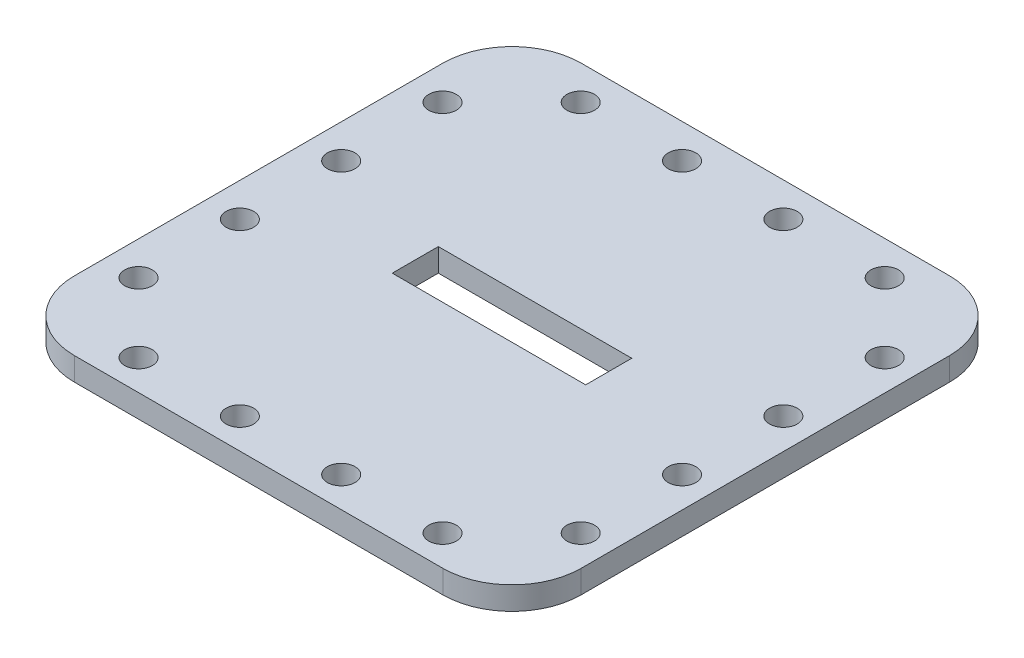
ISO-10303-21;
HEADER;
FILE_DESCRIPTION(('STEP AP214'),'2;1');
FILE_NAME('part.step','',(''),(''),'','','');
FILE_SCHEMA(('AUTOMOTIVE_DESIGN { 1 0 10303 214 1 1 1 1 }'));
ENDSEC;
DATA;
#1=APPLICATION_CONTEXT('core data for automotive mechanical design processes');
#2=APPLICATION_PROTOCOL_DEFINITION('international standard','automotive_design',2000,#1);
#3=PRODUCT_CONTEXT('',#1,'mechanical');
#4=PRODUCT('Part','Part','',(#3));
#5=PRODUCT_RELATED_PRODUCT_CATEGORY('part','',(#4));
#6=PRODUCT_DEFINITION_FORMATION('','',#4);
#7=PRODUCT_DEFINITION_CONTEXT('part definition',#1,'design');
#8=PRODUCT_DEFINITION('design','',#6,#7);
#9=PRODUCT_DEFINITION_SHAPE('','',#8);
#10=(LENGTH_UNIT() NAMED_UNIT(*) SI_UNIT(.MILLI.,.METRE.));
#11=(NAMED_UNIT(*) PLANE_ANGLE_UNIT() SI_UNIT($,.RADIAN.));
#12=(NAMED_UNIT(*) SI_UNIT($,.STERADIAN.) SOLID_ANGLE_UNIT());
#13=UNCERTAINTY_MEASURE_WITH_UNIT(LENGTH_MEASURE(1.E-05),#10,'distance_accuracy_value','');
#14=(GEOMETRIC_REPRESENTATION_CONTEXT(3) GLOBAL_UNCERTAINTY_ASSIGNED_CONTEXT((#13)) GLOBAL_UNIT_ASSIGNED_CONTEXT((#10,
#11,#12)) REPRESENTATION_CONTEXT('',''));
#15=CARTESIAN_POINT('',(0.,0.,0.));
#16=DIRECTION('',(0.,0.,1.));
#17=DIRECTION('',(1.,0.,0.));
#18=AXIS2_PLACEMENT_3D('',#15,#16,#17);
#19=CARTESIAN_POINT('',(40.,5.,55.));
#20=DIRECTION('',(0.,1.,0.));
#21=DIRECTION('',(0.,0.,1.));
#22=AXIS2_PLACEMENT_3D('',#19,#20,#21);
#23=PLANE('',#22);
#24=DIRECTION('',(0.,0.,-1.));
#25=VECTOR('',#24,1.);
#26=CARTESIAN_POINT('',(21.,5.,5.));
#27=LINE('',#26,#25);
#28=CARTESIAN_POINT('',(21.,5.,5.));
#29=VERTEX_POINT('',#28);
#30=CARTESIAN_POINT('',(21.,5.,-5.));
#31=VERTEX_POINT('',#30);
#32=EDGE_CURVE('E54',#29,#31,#27,.T.);
#33=ORIENTED_EDGE('',*,*,#32,.F.);
#34=DIRECTION('',(1.,0.,0.));
#35=VECTOR('',#34,1.);
#36=CARTESIAN_POINT('',(-21.,5.,5.));
#37=LINE('',#36,#35);
#38=CARTESIAN_POINT('',(-21.,5.,5.));
#39=VERTEX_POINT('',#38);
#40=EDGE_CURVE('E145',#39,#29,#37,.T.);
#41=ORIENTED_EDGE('',*,*,#40,.F.);
#42=DIRECTION('',(0.,0.,1.));
#43=VECTOR('',#42,1.);
#44=CARTESIAN_POINT('',(-21.,5.,5.));
#45=LINE('',#44,#43);
#46=CARTESIAN_POINT('',(-21.,5.,-5.));
#47=VERTEX_POINT('',#46);
#48=EDGE_CURVE('E130',#47,#39,#45,.T.);
#49=ORIENTED_EDGE('',*,*,#48,.F.);
#50=DIRECTION('',(-1.,0.,0.));
#51=VECTOR('',#50,1.);
#52=CARTESIAN_POINT('',(-21.,5.,-5.));
#53=LINE('',#52,#51);
#54=EDGE_CURVE('E139',#31,#47,#53,.T.);
#55=ORIENTED_EDGE('',*,*,#54,.F.);
#56=EDGE_LOOP('',(#33,#41,#49,#55));
#57=FACE_BOUND('',#56,.T.);
#58=CARTESIAN_POINT('',(48.3346963055934,5.,-10.5816296180082));
#59=DIRECTION('',(0.,-1.,0.));
#60=DIRECTION('',(0.,0.,-1.));
#61=AXIS2_PLACEMENT_3D('',#58,#59,#60);
#62=CIRCLE('',#61,3.00000000000002);
#63=CARTESIAN_POINT('',(48.3346963055934,5.,-13.5816296180082));
#64=VERTEX_POINT('',#63);
#65=EDGE_CURVE('E208',#64,#64,#62,.T.);
#66=ORIENTED_EDGE('',*,*,#65,.T.);
#67=EDGE_LOOP('',(#66));
#68=FACE_BOUND('',#67,.T.);
#69=CARTESIAN_POINT('',(-32.6653036944065,5.,-47.5816296180083));
#70=DIRECTION('',(0.,-1.,0.));
#71=DIRECTION('',(0.,0.,-1.));
#72=AXIS2_PLACEMENT_3D('',#69,#70,#71);
#73=CIRCLE('',#72,3.00000000000001);
#74=CARTESIAN_POINT('',(-32.6653036944065,5.,-50.5816296180083));
#75=VERTEX_POINT('',#74);
#76=EDGE_CURVE('E220',#75,#75,#73,.T.);
#77=ORIENTED_EDGE('',*,*,#76,.T.);
#78=EDGE_LOOP('',(#77));
#79=FACE_BOUND('',#78,.T.);
#80=CARTESIAN_POINT('',(-47.6653036944066,5.,-32.5816296180082));
#81=DIRECTION('',(0.,-1.,0.));
#82=DIRECTION('',(0.,0.,-1.));
#83=AXIS2_PLACEMENT_3D('',#80,#81,#82);
#84=CIRCLE('',#83,3.);
#85=CARTESIAN_POINT('',(-47.6653036944066,5.,-35.5816296180082));
#86=VERTEX_POINT('',#85);
#87=EDGE_CURVE('E223',#86,#86,#84,.T.);
#88=ORIENTED_EDGE('',*,*,#87,.T.);
#89=EDGE_LOOP('',(#88));
#90=FACE_BOUND('',#89,.T.);
#91=CARTESIAN_POINT('',(-47.6653036944066,5.,-10.5816296180082));
#92=DIRECTION('',(0.,-1.,0.));
#93=DIRECTION('',(0.,0.,-1.));
#94=AXIS2_PLACEMENT_3D('',#91,#92,#93);
#95=CIRCLE('',#94,3.00000000000003);
#96=CARTESIAN_POINT('',(-47.6653036944066,5.,-13.5816296180083));
#97=VERTEX_POINT('',#96);
#98=EDGE_CURVE('E226',#97,#97,#95,.T.);
#99=ORIENTED_EDGE('',*,*,#98,.T.);
#100=EDGE_LOOP('',(#99));
#101=FACE_BOUND('',#100,.T.);
#102=CARTESIAN_POINT('',(-47.6653036944066,5.,11.4183703819918));
#103=DIRECTION('',(0.,-1.,0.));
#104=DIRECTION('',(0.,0.,-1.));
#105=AXIS2_PLACEMENT_3D('',#102,#103,#104);
#106=CIRCLE('',#105,2.99999999999997);
#107=CARTESIAN_POINT('',(-47.6653036944066,5.,8.4183703819918));
#108=VERTEX_POINT('',#107);
#109=EDGE_CURVE('E229',#108,#108,#106,.T.);
#110=ORIENTED_EDGE('',*,*,#109,.T.);
#111=EDGE_LOOP('',(#110));
#112=FACE_BOUND('',#111,.T.);
#113=CARTESIAN_POINT('',(-10.6653036944066,5.,48.4183703819918));
#114=DIRECTION('',(0.,-1.,0.));
#115=DIRECTION('',(0.,0.,-1.));
#116=AXIS2_PLACEMENT_3D('',#113,#114,#115);
#117=CIRCLE('',#116,3.00000000000002);
#118=CARTESIAN_POINT('',(-10.6653036944066,5.,45.4183703819917));
#119=VERTEX_POINT('',#118);
#120=EDGE_CURVE('E232',#119,#119,#117,.T.);
#121=ORIENTED_EDGE('',*,*,#120,.T.);
#122=EDGE_LOOP('',(#121));
#123=FACE_BOUND('',#122,.T.);
#124=CARTESIAN_POINT('',(11.3346963055934,5.,48.4183703819918));
#125=DIRECTION('',(0.,-1.,0.));
#126=DIRECTION('',(0.,0.,-1.));
#127=AXIS2_PLACEMENT_3D('',#124,#125,#126);
#128=CIRCLE('',#127,2.99999999999997);
#129=CARTESIAN_POINT('',(11.3346963055934,5.,45.4183703819918));
#130=VERTEX_POINT('',#129);
#131=EDGE_CURVE('E235',#130,#130,#128,.T.);
#132=ORIENTED_EDGE('',*,*,#131,.T.);
#133=EDGE_LOOP('',(#132));
#134=FACE_BOUND('',#133,.T.);
#135=CARTESIAN_POINT('',(33.3346963055934,5.,48.4183703819918));
#136=DIRECTION('',(0.,-1.,0.));
#137=DIRECTION('',(0.,0.,-1.));
#138=AXIS2_PLACEMENT_3D('',#135,#136,#137);
#139=CIRCLE('',#138,3.00000000000001);
#140=CARTESIAN_POINT('',(33.3346963055934,5.,45.4183703819917));
#141=VERTEX_POINT('',#140);
#142=EDGE_CURVE('E238',#141,#141,#139,.T.);
#143=ORIENTED_EDGE('',*,*,#142,.T.);
#144=EDGE_LOOP('',(#143));
#145=FACE_BOUND('',#144,.T.);
#146=CARTESIAN_POINT('',(48.3346963055934,5.,11.4183703819918));
#147=DIRECTION('',(0.,-1.,0.));
#148=DIRECTION('',(0.,0.,-1.));
#149=AXIS2_PLACEMENT_3D('',#146,#147,#148);
#150=CIRCLE('',#149,2.99999999999997);
#151=CARTESIAN_POINT('',(48.3346963055934,5.,8.4183703819918));
#152=VERTEX_POINT('',#151);
#153=EDGE_CURVE('E241',#152,#152,#150,.T.);
#154=ORIENTED_EDGE('',*,*,#153,.T.);
#155=EDGE_LOOP('',(#154));
#156=FACE_BOUND('',#155,.T.);
#157=CARTESIAN_POINT('',(48.3346963055935,5.,-32.5816296180082));
#158=DIRECTION('',(0.,-1.,0.));
#159=DIRECTION('',(0.,0.,-1.));
#160=AXIS2_PLACEMENT_3D('',#157,#158,#159);
#161=CIRCLE('',#160,3.00000000000001);
#162=CARTESIAN_POINT('',(48.3346963055935,5.,-35.5816296180082));
#163=VERTEX_POINT('',#162);
#164=EDGE_CURVE('E244',#163,#163,#161,.T.);
#165=ORIENTED_EDGE('',*,*,#164,.T.);
#166=EDGE_LOOP('',(#165));
#167=FACE_BOUND('',#166,.T.);
#168=CARTESIAN_POINT('',(33.3346963055935,5.,-47.5816296180082));
#169=DIRECTION('',(0.,-1.,0.));
#170=DIRECTION('',(0.,0.,-1.));
#171=AXIS2_PLACEMENT_3D('',#168,#169,#170);
#172=CIRCLE('',#171,2.99999999999997);
#173=CARTESIAN_POINT('',(33.3346963055935,5.,-50.5816296180082));
#174=VERTEX_POINT('',#173);
#175=EDGE_CURVE('E247',#174,#174,#172,.T.);
#176=ORIENTED_EDGE('',*,*,#175,.T.);
#177=EDGE_LOOP('',(#176));
#178=FACE_BOUND('',#177,.T.);
#179=CARTESIAN_POINT('',(11.3346963055935,5.,-47.5816296180082));
#180=DIRECTION('',(0.,-1.,0.));
#181=DIRECTION('',(0.,0.,-1.));
#182=AXIS2_PLACEMENT_3D('',#179,#180,#181);
#183=CIRCLE('',#182,2.99999999999997);
#184=CARTESIAN_POINT('',(11.3346963055935,5.,-50.5816296180082));
#185=VERTEX_POINT('',#184);
#186=EDGE_CURVE('E250',#185,#185,#183,.T.);
#187=ORIENTED_EDGE('',*,*,#186,.T.);
#188=EDGE_LOOP('',(#187));
#189=FACE_BOUND('',#188,.T.);
#190=CARTESIAN_POINT('',(-10.6653036944065,5.,-47.5816296180082));
#191=DIRECTION('',(0.,-1.,0.));
#192=DIRECTION('',(0.,0.,-1.));
#193=AXIS2_PLACEMENT_3D('',#190,#191,#192);
#194=CIRCLE('',#193,3.00000000000002);
#195=CARTESIAN_POINT('',(-10.6653036944065,5.,-50.5816296180083));
#196=VERTEX_POINT('',#195);
#197=EDGE_CURVE('E253',#196,#196,#194,.T.);
#198=ORIENTED_EDGE('',*,*,#197,.T.);
#199=EDGE_LOOP('',(#198));
#200=FACE_BOUND('',#199,.T.);
#201=CARTESIAN_POINT('',(-47.6653036944065,5.,33.4183703819918));
#202=DIRECTION('',(0.,-1.,0.));
#203=DIRECTION('',(0.,0.,-1.));
#204=AXIS2_PLACEMENT_3D('',#201,#202,#203);
#205=CIRCLE('',#204,3.);
#206=CARTESIAN_POINT('',(-47.6653036944065,5.,30.4183703819918));
#207=VERTEX_POINT('',#206);
#208=EDGE_CURVE('E256',#207,#207,#205,.T.);
#209=ORIENTED_EDGE('',*,*,#208,.T.);
#210=EDGE_LOOP('',(#209));
#211=FACE_BOUND('',#210,.T.);
#212=CARTESIAN_POINT('',(-32.6653036944065,5.,48.4183703819918));
#213=DIRECTION('',(0.,-1.,0.));
#214=DIRECTION('',(0.,0.,-1.));
#215=AXIS2_PLACEMENT_3D('',#212,#213,#214);
#216=CIRCLE('',#215,3.00000000000001);
#217=CARTESIAN_POINT('',(-32.6653036944065,5.,45.4183703819918));
#218=VERTEX_POINT('',#217);
#219=EDGE_CURVE('E259',#218,#218,#216,.T.);
#220=ORIENTED_EDGE('',*,*,#219,.T.);
#221=EDGE_LOOP('',(#220));
#222=FACE_BOUND('',#221,.T.);
#223=CARTESIAN_POINT('',(48.3346963055934,5.,33.4183703819918));
#224=DIRECTION('',(0.,-1.,0.));
#225=DIRECTION('',(0.,0.,-1.));
#226=AXIS2_PLACEMENT_3D('',#223,#224,#225);
#227=CIRCLE('',#226,3.00000000000001);
#228=CARTESIAN_POINT('',(48.3346963055934,5.,30.4183703819918));
#229=VERTEX_POINT('',#228);
#230=EDGE_CURVE('E262',#229,#229,#227,.T.);
#231=ORIENTED_EDGE('',*,*,#230,.T.);
#232=EDGE_LOOP('',(#231));
#233=FACE_BOUND('',#232,.T.);
#234=DIRECTION('',(1.,0.,0.));
#235=VECTOR('',#234,1.);
#236=CARTESIAN_POINT('',(-55.,5.,55.));
#237=LINE('',#236,#235);
#238=CARTESIAN_POINT('',(-40.,5.,55.));
#239=VERTEX_POINT('',#238);
#240=CARTESIAN_POINT('',(40.,5.,55.));
#241=VERTEX_POINT('',#240);
#242=EDGE_CURVE('E195',#239,#241,#237,.T.);
#243=ORIENTED_EDGE('',*,*,#242,.T.);
#244=CARTESIAN_POINT('',(40.,5.,40.));
#245=DIRECTION('',(0.,-1.,0.));
#246=DIRECTION('',(0.,0.,-1.));
#247=AXIS2_PLACEMENT_3D('',#244,#245,#246);
#248=CIRCLE('',#247,15.);
#249=CARTESIAN_POINT('',(55.,5.,40.));
#250=VERTEX_POINT('',#249);
#251=EDGE_CURVE('E152',#241,#250,#248,.F.);
#252=ORIENTED_EDGE('',*,*,#251,.T.);
#253=DIRECTION('',(0.,0.,-1.));
#254=VECTOR('',#253,1.);
#255=CARTESIAN_POINT('',(55.,5.,55.));
#256=LINE('',#255,#254);
#257=CARTESIAN_POINT('',(55.,5.,-40.));
#258=VERTEX_POINT('',#257);
#259=EDGE_CURVE('E200',#250,#258,#256,.T.);
#260=ORIENTED_EDGE('',*,*,#259,.T.);
#261=CARTESIAN_POINT('',(40.,5.,-40.));
#262=DIRECTION('',(0.,-1.,0.));
#263=DIRECTION('',(0.,0.,-1.));
#264=AXIS2_PLACEMENT_3D('',#261,#262,#263);
#265=CIRCLE('',#264,15.);
#266=CARTESIAN_POINT('',(40.,5.,-55.));
#267=VERTEX_POINT('',#266);
#268=EDGE_CURVE('E184',#258,#267,#265,.F.);
#269=ORIENTED_EDGE('',*,*,#268,.T.);
#270=DIRECTION('',(-1.,0.,0.));
#271=VECTOR('',#270,1.);
#272=CARTESIAN_POINT('',(-55.,5.,-55.));
#273=LINE('',#272,#271);
#274=CARTESIAN_POINT('',(-40.,5.,-55.));
#275=VERTEX_POINT('',#274);
#276=EDGE_CURVE('E214',#267,#275,#273,.T.);
#277=ORIENTED_EDGE('',*,*,#276,.T.);
#278=CARTESIAN_POINT('',(-40.,5.,-40.));
#279=DIRECTION('',(0.,-1.,0.));
#280=DIRECTION('',(0.,0.,-1.));
#281=AXIS2_PLACEMENT_3D('',#278,#279,#280);
#282=CIRCLE('',#281,15.);
#283=CARTESIAN_POINT('',(-55.,5.,-40.));
#284=VERTEX_POINT('',#283);
#285=EDGE_CURVE('E174',#275,#284,#282,.F.);
#286=ORIENTED_EDGE('',*,*,#285,.T.);
#287=DIRECTION('',(0.,0.,1.));
#288=VECTOR('',#287,1.);
#289=CARTESIAN_POINT('',(-55.,5.,55.));
#290=LINE('',#289,#288);
#291=CARTESIAN_POINT('',(-55.,5.,40.));
#292=VERTEX_POINT('',#291);
#293=EDGE_CURVE('E211',#284,#292,#290,.T.);
#294=ORIENTED_EDGE('',*,*,#293,.T.);
#295=CARTESIAN_POINT('',(-40.,5.,40.));
#296=DIRECTION('',(0.,-1.,0.));
#297=DIRECTION('',(0.,0.,-1.));
#298=AXIS2_PLACEMENT_3D('',#295,#296,#297);
#299=CIRCLE('',#298,15.);
#300=EDGE_CURVE('E164',#292,#239,#299,.F.);
#301=ORIENTED_EDGE('',*,*,#300,.T.);
#302=EDGE_LOOP('',(#243,#252,#260,#269,#277,#286,#294,#301));
#303=FACE_BOUND('',#302,.T.);
#304=ADVANCED_FACE('F40',(#57,#68,#79,#90,#101,#112,#123,#134,#145,#156,#167,#178,#189,#200,
#211,#222,#233,#303),#23,.T.);
#305=CARTESIAN_POINT('',(40.,5.,-40.));
#306=DIRECTION('',(0.,1.,0.));
#307=DIRECTION('',(0.,0.,1.));
#308=AXIS2_PLACEMENT_3D('',#305,#306,#307);
#309=CYLINDRICAL_SURFACE('',#308,15.);
#310=DIRECTION('',(0.,1.,0.));
#311=VECTOR('',#310,1.);
#312=CARTESIAN_POINT('',(55.,5.,-40.));
#313=LINE('',#312,#311);
#314=CARTESIAN_POINT('',(55.,0.,-40.));
#315=VERTEX_POINT('',#314);
#316=EDGE_CURVE('E192',#315,#258,#313,.T.);
#317=ORIENTED_EDGE('',*,*,#316,.F.);
#318=CARTESIAN_POINT('',(40.,0.,-40.));
#319=DIRECTION('',(0.,-1.,0.));
#320=DIRECTION('',(0.,0.,-1.));
#321=AXIS2_PLACEMENT_3D('',#318,#319,#320);
#322=CIRCLE('',#321,15.);
#323=CARTESIAN_POINT('',(40.,0.,-55.));
#324=VERTEX_POINT('',#323);
#325=EDGE_CURVE('E186',#324,#315,#322,.T.);
#326=ORIENTED_EDGE('',*,*,#325,.F.);
#327=DIRECTION('',(0.,1.,0.));
#328=VECTOR('',#327,1.);
#329=CARTESIAN_POINT('',(40.,5.,-55.));
#330=LINE('',#329,#328);
#331=EDGE_CURVE('E189',#267,#324,#330,.F.);
#332=ORIENTED_EDGE('',*,*,#331,.F.);
#333=ORIENTED_EDGE('',*,*,#268,.F.);
#334=EDGE_LOOP('',(#317,#326,#332,#333));
#335=FACE_BOUND('',#334,.T.);
#336=ADVANCED_FACE('F338',(#335),#309,.T.);
#337=CARTESIAN_POINT('',(-40.,5.,-40.));
#338=DIRECTION('',(0.,1.,0.));
#339=DIRECTION('',(0.,0.,1.));
#340=AXIS2_PLACEMENT_3D('',#337,#338,#339);
#341=CYLINDRICAL_SURFACE('',#340,15.);
#342=DIRECTION('',(0.,1.,0.));
#343=VECTOR('',#342,1.);
#344=CARTESIAN_POINT('',(-40.,5.,-55.));
#345=LINE('',#344,#343);
#346=CARTESIAN_POINT('',(-40.,0.,-55.));
#347=VERTEX_POINT('',#346);
#348=EDGE_CURVE('E181',#347,#275,#345,.T.);
#349=ORIENTED_EDGE('',*,*,#348,.F.);
#350=CARTESIAN_POINT('',(-40.,0.,-40.));
#351=DIRECTION('',(0.,-1.,0.));
#352=DIRECTION('',(0.,0.,-1.));
#353=AXIS2_PLACEMENT_3D('',#350,#351,#352);
#354=CIRCLE('',#353,15.);
#355=CARTESIAN_POINT('',(-55.,0.,-40.));
#356=VERTEX_POINT('',#355);
#357=EDGE_CURVE('E176',#356,#347,#354,.T.);
#358=ORIENTED_EDGE('',*,*,#357,.F.);
#359=DIRECTION('',(0.,1.,0.));
#360=VECTOR('',#359,1.);
#361=CARTESIAN_POINT('',(-55.,5.,-40.));
#362=LINE('',#361,#360);
#363=EDGE_CURVE('E178',#284,#356,#362,.F.);
#364=ORIENTED_EDGE('',*,*,#363,.F.);
#365=ORIENTED_EDGE('',*,*,#285,.F.);
#366=EDGE_LOOP('',(#349,#358,#364,#365));
#367=FACE_BOUND('',#366,.T.);
#368=ADVANCED_FACE('F340',(#367),#341,.T.);
#369=CARTESIAN_POINT('',(-40.,5.,40.));
#370=DIRECTION('',(0.,1.,0.));
#371=DIRECTION('',(0.,0.,1.));
#372=AXIS2_PLACEMENT_3D('',#369,#370,#371);
#373=CYLINDRICAL_SURFACE('',#372,15.);
#374=DIRECTION('',(0.,1.,0.));
#375=VECTOR('',#374,1.);
#376=CARTESIAN_POINT('',(-55.,5.,40.));
#377=LINE('',#376,#375);
#378=CARTESIAN_POINT('',(-55.,0.,40.));
#379=VERTEX_POINT('',#378);
#380=EDGE_CURVE('E171',#379,#292,#377,.T.);
#381=ORIENTED_EDGE('',*,*,#380,.F.);
#382=CARTESIAN_POINT('',(-40.,0.,40.));
#383=DIRECTION('',(0.,-1.,0.));
#384=DIRECTION('',(0.,0.,-1.));
#385=AXIS2_PLACEMENT_3D('',#382,#383,#384);
#386=CIRCLE('',#385,15.);
#387=CARTESIAN_POINT('',(-40.,0.,55.));
#388=VERTEX_POINT('',#387);
#389=EDGE_CURVE('E166',#388,#379,#386,.T.);
#390=ORIENTED_EDGE('',*,*,#389,.F.);
#391=DIRECTION('',(0.,1.,0.));
#392=VECTOR('',#391,1.);
#393=CARTESIAN_POINT('',(-40.,5.,55.));
#394=LINE('',#393,#392);
#395=EDGE_CURVE('E168',#239,#388,#394,.F.);
#396=ORIENTED_EDGE('',*,*,#395,.F.);
#397=ORIENTED_EDGE('',*,*,#300,.F.);
#398=EDGE_LOOP('',(#381,#390,#396,#397));
#399=FACE_BOUND('',#398,.T.);
#400=ADVANCED_FACE('F346',(#399),#373,.T.);
#401=CARTESIAN_POINT('',(40.,5.,40.));
#402=DIRECTION('',(0.,1.,0.));
#403=DIRECTION('',(0.,0.,1.));
#404=AXIS2_PLACEMENT_3D('',#401,#402,#403);
#405=CYLINDRICAL_SURFACE('',#404,15.);
#406=DIRECTION('',(0.,1.,0.));
#407=VECTOR('',#406,1.);
#408=CARTESIAN_POINT('',(40.,5.,55.));
#409=LINE('',#408,#407);
#410=CARTESIAN_POINT('',(40.,0.,55.));
#411=VERTEX_POINT('',#410);
#412=EDGE_CURVE('E161',#411,#241,#409,.T.);
#413=ORIENTED_EDGE('',*,*,#412,.F.);
#414=CARTESIAN_POINT('',(40.,0.,40.));
#415=DIRECTION('',(0.,-1.,0.));
#416=DIRECTION('',(0.,0.,-1.));
#417=AXIS2_PLACEMENT_3D('',#414,#415,#416);
#418=CIRCLE('',#417,15.);
#419=CARTESIAN_POINT('',(55.,0.,40.));
#420=VERTEX_POINT('',#419);
#421=EDGE_CURVE('E156',#420,#411,#418,.T.);
#422=ORIENTED_EDGE('',*,*,#421,.F.);
#423=DIRECTION('',(0.,1.,0.));
#424=VECTOR('',#423,1.);
#425=CARTESIAN_POINT('',(55.,5.,40.));
#426=LINE('',#425,#424);
#427=EDGE_CURVE('E158',#250,#420,#426,.F.);
#428=ORIENTED_EDGE('',*,*,#427,.F.);
#429=ORIENTED_EDGE('',*,*,#251,.F.);
#430=EDGE_LOOP('',(#413,#422,#428,#429));
#431=FACE_BOUND('',#430,.T.);
#432=ADVANCED_FACE('F367',(#431),#405,.T.);
#433=CARTESIAN_POINT('',(0.,0.,0.));
#434=DIRECTION('',(0.,-1.,0.));
#435=DIRECTION('',(0.,0.,-1.));
#436=AXIS2_PLACEMENT_3D('',#433,#434,#435);
#437=PLANE('',#436);
#438=DIRECTION('',(0.,0.,1.));
#439=VECTOR('',#438,1.);
#440=CARTESIAN_POINT('',(21.,0.,0.));
#441=LINE('',#440,#439);
#442=CARTESIAN_POINT('',(21.,0.,-5.));
#443=VERTEX_POINT('',#442);
#444=CARTESIAN_POINT('',(21.,0.,5.));
#445=VERTEX_POINT('',#444);
#446=EDGE_CURVE('E11',#443,#445,#441,.T.);
#447=ORIENTED_EDGE('',*,*,#446,.F.);
#448=DIRECTION('',(1.,0.,0.));
#449=VECTOR('',#448,1.);
#450=CARTESIAN_POINT('',(0.,0.,-5.));
#451=LINE('',#450,#449);
#452=CARTESIAN_POINT('',(-21.,0.,-5.));
#453=VERTEX_POINT('',#452);
#454=EDGE_CURVE('E296',#453,#443,#451,.T.);
#455=ORIENTED_EDGE('',*,*,#454,.F.);
#456=DIRECTION('',(0.,0.,-1.));
#457=VECTOR('',#456,1.);
#458=CARTESIAN_POINT('',(-21.,0.,0.));
#459=LINE('',#458,#457);
#460=CARTESIAN_POINT('',(-21.,0.,5.));
#461=VERTEX_POINT('',#460);
#462=EDGE_CURVE('E133',#461,#453,#459,.T.);
#463=ORIENTED_EDGE('',*,*,#462,.F.);
#464=DIRECTION('',(-1.,0.,0.));
#465=VECTOR('',#464,1.);
#466=CARTESIAN_POINT('',(0.,0.,5.));
#467=LINE('',#466,#465);
#468=EDGE_CURVE('E47',#445,#461,#467,.T.);
#469=ORIENTED_EDGE('',*,*,#468,.F.);
#470=EDGE_LOOP('',(#447,#455,#463,#469));
#471=FACE_BOUND('',#470,.T.);
#472=CARTESIAN_POINT('',(48.3346963055934,0.,-10.5816296180082));
#473=DIRECTION('',(0.,-1.,0.));
#474=DIRECTION('',(0.,0.,-1.));
#475=AXIS2_PLACEMENT_3D('',#472,#473,#474);
#476=CIRCLE('',#475,3.00000000000002);
#477=CARTESIAN_POINT('',(48.3346963055934,0.,-13.5816296180082));
#478=VERTEX_POINT('',#477);
#479=EDGE_CURVE('E268',#478,#478,#476,.T.);
#480=ORIENTED_EDGE('',*,*,#479,.F.);
#481=EDGE_LOOP('',(#480));
#482=FACE_BOUND('',#481,.T.);
#483=CARTESIAN_POINT('',(-32.6653036944065,0.,-47.5816296180083));
#484=DIRECTION('',(0.,-1.,0.));
#485=DIRECTION('',(0.,0.,-1.));
#486=AXIS2_PLACEMENT_3D('',#483,#484,#485);
#487=CIRCLE('',#486,3.00000000000001);
#488=CARTESIAN_POINT('',(-32.6653036944065,0.,-50.5816296180083));
#489=VERTEX_POINT('',#488);
#490=EDGE_CURVE('E288',#489,#489,#487,.T.);
#491=ORIENTED_EDGE('',*,*,#490,.F.);
#492=EDGE_LOOP('',(#491));
#493=FACE_BOUND('',#492,.T.);
#494=CARTESIAN_POINT('',(-47.6653036944066,0.,-32.5816296180082));
#495=DIRECTION('',(0.,-1.,0.));
#496=DIRECTION('',(0.,0.,-1.));
#497=AXIS2_PLACEMENT_3D('',#494,#495,#496);
#498=CIRCLE('',#497,3.);
#499=CARTESIAN_POINT('',(-47.6653036944066,0.,-35.5816296180082));
#500=VERTEX_POINT('',#499);
#501=EDGE_CURVE('E285',#500,#500,#498,.T.);
#502=ORIENTED_EDGE('',*,*,#501,.F.);
#503=EDGE_LOOP('',(#502));
#504=FACE_BOUND('',#503,.T.);
#505=CARTESIAN_POINT('',(-47.6653036944066,0.,-10.5816296180082));
#506=DIRECTION('',(0.,-1.,0.));
#507=DIRECTION('',(0.,0.,-1.));
#508=AXIS2_PLACEMENT_3D('',#505,#506,#507);
#509=CIRCLE('',#508,3.00000000000003);
#510=CARTESIAN_POINT('',(-47.6653036944066,0.,-13.5816296180083));
#511=VERTEX_POINT('',#510);
#512=EDGE_CURVE('E282',#511,#511,#509,.T.);
#513=ORIENTED_EDGE('',*,*,#512,.F.);
#514=EDGE_LOOP('',(#513));
#515=FACE_BOUND('',#514,.T.);
#516=CARTESIAN_POINT('',(-47.6653036944066,0.,11.4183703819918));
#517=DIRECTION('',(0.,-1.,0.));
#518=DIRECTION('',(0.,0.,-1.));
#519=AXIS2_PLACEMENT_3D('',#516,#517,#518);
#520=CIRCLE('',#519,2.99999999999997);
#521=CARTESIAN_POINT('',(-47.6653036944066,0.,8.4183703819918));
#522=VERTEX_POINT('',#521);
#523=EDGE_CURVE('E279',#522,#522,#520,.T.);
#524=ORIENTED_EDGE('',*,*,#523,.F.);
#525=EDGE_LOOP('',(#524));
#526=FACE_BOUND('',#525,.T.);
#527=CARTESIAN_POINT('',(-10.6653036944066,0.,48.4183703819918));
#528=DIRECTION('',(0.,-1.,0.));
#529=DIRECTION('',(0.,0.,-1.));
#530=AXIS2_PLACEMENT_3D('',#527,#528,#529);
#531=CIRCLE('',#530,3.00000000000002);
#532=CARTESIAN_POINT('',(-10.6653036944066,0.,45.4183703819917));
#533=VERTEX_POINT('',#532);
#534=EDGE_CURVE('E276',#533,#533,#531,.T.);
#535=ORIENTED_EDGE('',*,*,#534,.F.);
#536=EDGE_LOOP('',(#535));
#537=FACE_BOUND('',#536,.T.);
#538=CARTESIAN_POINT('',(11.3346963055934,0.,48.4183703819918));
#539=DIRECTION('',(0.,-1.,0.));
#540=DIRECTION('',(0.,0.,-1.));
#541=AXIS2_PLACEMENT_3D('',#538,#539,#540);
#542=CIRCLE('',#541,2.99999999999997);
#543=CARTESIAN_POINT('',(11.3346963055934,0.,45.4183703819918));
#544=VERTEX_POINT('',#543);
#545=EDGE_CURVE('E273',#544,#544,#542,.T.);
#546=ORIENTED_EDGE('',*,*,#545,.F.);
#547=EDGE_LOOP('',(#546));
#548=FACE_BOUND('',#547,.T.);
#549=CARTESIAN_POINT('',(33.3346963055934,0.,48.4183703819918));
#550=DIRECTION('',(0.,-1.,0.));
#551=DIRECTION('',(0.,0.,-1.));
#552=AXIS2_PLACEMENT_3D('',#549,#550,#551);
#553=CIRCLE('',#552,3.00000000000001);
#554=CARTESIAN_POINT('',(33.3346963055934,0.,45.4183703819917));
#555=VERTEX_POINT('',#554);
#556=EDGE_CURVE('E269',#555,#555,#553,.T.);
#557=ORIENTED_EDGE('',*,*,#556,.F.);
#558=EDGE_LOOP('',(#557));
#559=FACE_BOUND('',#558,.T.);
#560=CARTESIAN_POINT('',(48.3346963055934,0.,11.4183703819918));
#561=DIRECTION('',(0.,-1.,0.));
#562=DIRECTION('',(0.,0.,-1.));
#563=AXIS2_PLACEMENT_3D('',#560,#561,#562);
#564=CIRCLE('',#563,2.99999999999997);
#565=CARTESIAN_POINT('',(48.3346963055934,0.,8.4183703819918));
#566=VERTEX_POINT('',#565);
#567=EDGE_CURVE('E272',#566,#566,#564,.T.);
#568=ORIENTED_EDGE('',*,*,#567,.F.);
#569=EDGE_LOOP('',(#568));
#570=FACE_BOUND('',#569,.T.);
#571=CARTESIAN_POINT('',(48.3346963055935,0.,-32.5816296180082));
#572=DIRECTION('',(0.,-1.,0.));
#573=DIRECTION('',(0.,0.,-1.));
#574=AXIS2_PLACEMENT_3D('',#571,#572,#573);
#575=CIRCLE('',#574,3.00000000000001);
#576=CARTESIAN_POINT('',(48.3346963055935,0.,-35.5816296180082));
#577=VERTEX_POINT('',#576);
#578=EDGE_CURVE('E309',#577,#577,#575,.T.);
#579=ORIENTED_EDGE('',*,*,#578,.F.);
#580=EDGE_LOOP('',(#579));
#581=FACE_BOUND('',#580,.T.);
#582=CARTESIAN_POINT('',(33.3346963055935,0.,-47.5816296180082));
#583=DIRECTION('',(0.,-1.,0.));
#584=DIRECTION('',(0.,0.,-1.));
#585=AXIS2_PLACEMENT_3D('',#582,#583,#584);
#586=CIRCLE('',#585,2.99999999999997);
#587=CARTESIAN_POINT('',(33.3346963055935,0.,-50.5816296180082));
#588=VERTEX_POINT('',#587);
#589=EDGE_CURVE('E306',#588,#588,#586,.T.);
#590=ORIENTED_EDGE('',*,*,#589,.F.);
#591=EDGE_LOOP('',(#590));
#592=FACE_BOUND('',#591,.T.);
#593=CARTESIAN_POINT('',(11.3346963055935,0.,-47.5816296180082));
#594=DIRECTION('',(0.,-1.,0.));
#595=DIRECTION('',(0.,0.,-1.));
#596=AXIS2_PLACEMENT_3D('',#593,#594,#595);
#597=CIRCLE('',#596,2.99999999999997);
#598=CARTESIAN_POINT('',(11.3346963055935,0.,-50.5816296180082));
#599=VERTEX_POINT('',#598);
#600=EDGE_CURVE('E303',#599,#599,#597,.T.);
#601=ORIENTED_EDGE('',*,*,#600,.F.);
#602=EDGE_LOOP('',(#601));
#603=FACE_BOUND('',#602,.T.);
#604=CARTESIAN_POINT('',(-10.6653036944065,0.,-47.5816296180082));
#605=DIRECTION('',(0.,-1.,0.));
#606=DIRECTION('',(0.,0.,-1.));
#607=AXIS2_PLACEMENT_3D('',#604,#605,#606);
#608=CIRCLE('',#607,3.00000000000002);
#609=CARTESIAN_POINT('',(-10.6653036944065,0.,-50.5816296180083));
#610=VERTEX_POINT('',#609);
#611=EDGE_CURVE('E300',#610,#610,#608,.T.);
#612=ORIENTED_EDGE('',*,*,#611,.F.);
#613=EDGE_LOOP('',(#612));
#614=FACE_BOUND('',#613,.T.);
#615=CARTESIAN_POINT('',(-47.6653036944065,0.,33.4183703819918));
#616=DIRECTION('',(0.,-1.,0.));
#617=DIRECTION('',(0.,0.,-1.));
#618=AXIS2_PLACEMENT_3D('',#615,#616,#617);
#619=CIRCLE('',#618,3.);
#620=CARTESIAN_POINT('',(-47.6653036944065,0.,30.4183703819918));
#621=VERTEX_POINT('',#620);
#622=EDGE_CURVE('E297',#621,#621,#619,.T.);
#623=ORIENTED_EDGE('',*,*,#622,.F.);
#624=EDGE_LOOP('',(#623));
#625=FACE_BOUND('',#624,.T.);
#626=CARTESIAN_POINT('',(-32.6653036944065,0.,48.4183703819918));
#627=DIRECTION('',(0.,-1.,0.));
#628=DIRECTION('',(0.,0.,-1.));
#629=AXIS2_PLACEMENT_3D('',#626,#627,#628);
#630=CIRCLE('',#629,3.00000000000001);
#631=CARTESIAN_POINT('',(-32.6653036944065,0.,45.4183703819918));
#632=VERTEX_POINT('',#631);
#633=EDGE_CURVE('E293',#632,#632,#630,.T.);
#634=ORIENTED_EDGE('',*,*,#633,.F.);
#635=EDGE_LOOP('',(#634));
#636=FACE_BOUND('',#635,.T.);
#637=CARTESIAN_POINT('',(48.3346963055934,0.,33.4183703819918));
#638=DIRECTION('',(0.,-1.,0.));
#639=DIRECTION('',(0.,0.,-1.));
#640=AXIS2_PLACEMENT_3D('',#637,#638,#639);
#641=CIRCLE('',#640,3.00000000000001);
#642=CARTESIAN_POINT('',(48.3346963055934,0.,30.4183703819918));
#643=VERTEX_POINT('',#642);
#644=EDGE_CURVE('E265',#643,#643,#641,.T.);
#645=ORIENTED_EDGE('',*,*,#644,.F.);
#646=EDGE_LOOP('',(#645));
#647=FACE_BOUND('',#646,.T.);
#648=DIRECTION('',(0.,0.,-1.));
#649=VECTOR('',#648,1.);
#650=CARTESIAN_POINT('',(55.,0.,55.));
#651=LINE('',#650,#649);
#652=EDGE_CURVE('E206',#420,#315,#651,.T.);
#653=ORIENTED_EDGE('',*,*,#652,.F.);
#654=ORIENTED_EDGE('',*,*,#421,.T.);
#655=DIRECTION('',(1.,0.,0.));
#656=VECTOR('',#655,1.);
#657=CARTESIAN_POINT('',(-55.,0.,55.));
#658=LINE('',#657,#656);
#659=EDGE_CURVE('E196',#388,#411,#658,.T.);
#660=ORIENTED_EDGE('',*,*,#659,.F.);
#661=ORIENTED_EDGE('',*,*,#389,.T.);
#662=DIRECTION('',(0.,0.,1.));
#663=VECTOR('',#662,1.);
#664=CARTESIAN_POINT('',(-55.,0.,55.));
#665=LINE('',#664,#663);
#666=EDGE_CURVE('E199',#356,#379,#665,.T.);
#667=ORIENTED_EDGE('',*,*,#666,.F.);
#668=ORIENTED_EDGE('',*,*,#357,.T.);
#669=DIRECTION('',(-1.,0.,0.));
#670=VECTOR('',#669,1.);
#671=CARTESIAN_POINT('',(-55.,0.,-55.));
#672=LINE('',#671,#670);
#673=EDGE_CURVE('E203',#324,#347,#672,.T.);
#674=ORIENTED_EDGE('',*,*,#673,.F.);
#675=ORIENTED_EDGE('',*,*,#325,.T.);
#676=EDGE_LOOP('',(#653,#654,#660,#661,#667,#668,#674,#675));
#677=FACE_BOUND('',#676,.T.);
#678=ADVANCED_FACE('F321',(#471,#482,#493,#504,#515,#526,#537,#548,#559,#570,#581,#592,#603,
#614,#625,#636,#647,#677),#437,.T.);
#679=CARTESIAN_POINT('',(48.3346963055934,10.,-10.5816296180082));
#680=DIRECTION('',(0.,-1.,0.));
#681=DIRECTION('',(0.,0.,-1.));
#682=AXIS2_PLACEMENT_3D('',#679,#680,#681);
#683=CYLINDRICAL_SURFACE('',#682,3.00000000000002);
#684=ORIENTED_EDGE('',*,*,#479,.T.);
#685=EDGE_LOOP('',(#684));
#686=FACE_BOUND('',#685,.T.);
#687=ORIENTED_EDGE('',*,*,#65,.F.);
#688=EDGE_LOOP('',(#687));
#689=FACE_BOUND('',#688,.T.);
#690=ADVANCED_FACE('F366',(#686,#689),#683,.F.);
#691=CARTESIAN_POINT('',(-32.6653036944065,10.,-47.5816296180083));
#692=DIRECTION('',(0.,-1.,0.));
#693=DIRECTION('',(0.,0.,-1.));
#694=AXIS2_PLACEMENT_3D('',#691,#692,#693);
#695=CYLINDRICAL_SURFACE('',#694,3.00000000000001);
#696=ORIENTED_EDGE('',*,*,#490,.T.);
#697=EDGE_LOOP('',(#696));
#698=FACE_BOUND('',#697,.T.);
#699=ORIENTED_EDGE('',*,*,#76,.F.);
#700=EDGE_LOOP('',(#699));
#701=FACE_BOUND('',#700,.T.);
#702=ADVANCED_FACE('F396',(#698,#701),#695,.F.);
#703=CARTESIAN_POINT('',(-47.6653036944066,10.,-32.5816296180082));
#704=DIRECTION('',(0.,-1.,0.));
#705=DIRECTION('',(0.,0.,-1.));
#706=AXIS2_PLACEMENT_3D('',#703,#704,#705);
#707=CYLINDRICAL_SURFACE('',#706,3.);
#708=ORIENTED_EDGE('',*,*,#501,.T.);
#709=EDGE_LOOP('',(#708));
#710=FACE_BOUND('',#709,.T.);
#711=ORIENTED_EDGE('',*,*,#87,.F.);
#712=EDGE_LOOP('',(#711));
#713=FACE_BOUND('',#712,.T.);
#714=ADVANCED_FACE('F392',(#710,#713),#707,.F.);
#715=CARTESIAN_POINT('',(-47.6653036944066,10.,-10.5816296180082));
#716=DIRECTION('',(0.,-1.,0.));
#717=DIRECTION('',(0.,0.,-1.));
#718=AXIS2_PLACEMENT_3D('',#715,#716,#717);
#719=CYLINDRICAL_SURFACE('',#718,3.00000000000003);
#720=ORIENTED_EDGE('',*,*,#512,.T.);
#721=EDGE_LOOP('',(#720));
#722=FACE_BOUND('',#721,.T.);
#723=ORIENTED_EDGE('',*,*,#98,.F.);
#724=EDGE_LOOP('',(#723));
#725=FACE_BOUND('',#724,.T.);
#726=ADVANCED_FACE('F388',(#722,#725),#719,.F.);
#727=CARTESIAN_POINT('',(-47.6653036944066,10.,11.4183703819918));
#728=DIRECTION('',(0.,-1.,0.));
#729=DIRECTION('',(0.,0.,-1.));
#730=AXIS2_PLACEMENT_3D('',#727,#728,#729);
#731=CYLINDRICAL_SURFACE('',#730,2.99999999999997);
#732=ORIENTED_EDGE('',*,*,#523,.T.);
#733=EDGE_LOOP('',(#732));
#734=FACE_BOUND('',#733,.T.);
#735=ORIENTED_EDGE('',*,*,#109,.F.);
#736=EDGE_LOOP('',(#735));
#737=FACE_BOUND('',#736,.T.);
#738=ADVANCED_FACE('F384',(#734,#737),#731,.F.);
#739=CARTESIAN_POINT('',(-10.6653036944066,10.,48.4183703819918));
#740=DIRECTION('',(0.,-1.,0.));
#741=DIRECTION('',(0.,0.,-1.));
#742=AXIS2_PLACEMENT_3D('',#739,#740,#741);
#743=CYLINDRICAL_SURFACE('',#742,3.00000000000002);
#744=ORIENTED_EDGE('',*,*,#534,.T.);
#745=EDGE_LOOP('',(#744));
#746=FACE_BOUND('',#745,.T.);
#747=ORIENTED_EDGE('',*,*,#120,.F.);
#748=EDGE_LOOP('',(#747));
#749=FACE_BOUND('',#748,.T.);
#750=ADVANCED_FACE('F380',(#746,#749),#743,.F.);
#751=CARTESIAN_POINT('',(11.3346963055934,10.,48.4183703819918));
#752=DIRECTION('',(0.,-1.,0.));
#753=DIRECTION('',(0.,0.,-1.));
#754=AXIS2_PLACEMENT_3D('',#751,#752,#753);
#755=CYLINDRICAL_SURFACE('',#754,2.99999999999997);
#756=ORIENTED_EDGE('',*,*,#545,.T.);
#757=EDGE_LOOP('',(#756));
#758=FACE_BOUND('',#757,.T.);
#759=ORIENTED_EDGE('',*,*,#131,.F.);
#760=EDGE_LOOP('',(#759));
#761=FACE_BOUND('',#760,.T.);
#762=ADVANCED_FACE('F376',(#758,#761),#755,.F.);
#763=CARTESIAN_POINT('',(33.3346963055934,10.,48.4183703819918));
#764=DIRECTION('',(0.,-1.,0.));
#765=DIRECTION('',(0.,0.,-1.));
#766=AXIS2_PLACEMENT_3D('',#763,#764,#765);
#767=CYLINDRICAL_SURFACE('',#766,3.00000000000001);
#768=ORIENTED_EDGE('',*,*,#556,.T.);
#769=EDGE_LOOP('',(#768));
#770=FACE_BOUND('',#769,.T.);
#771=ORIENTED_EDGE('',*,*,#142,.F.);
#772=EDGE_LOOP('',(#771));
#773=FACE_BOUND('',#772,.T.);
#774=ADVANCED_FACE('F372',(#770,#773),#767,.F.);
#775=CARTESIAN_POINT('',(48.3346963055934,10.,11.4183703819918));
#776=DIRECTION('',(0.,-1.,0.));
#777=DIRECTION('',(0.,0.,-1.));
#778=AXIS2_PLACEMENT_3D('',#775,#776,#777);
#779=CYLINDRICAL_SURFACE('',#778,2.99999999999997);
#780=ORIENTED_EDGE('',*,*,#567,.T.);
#781=EDGE_LOOP('',(#780));
#782=FACE_BOUND('',#781,.T.);
#783=ORIENTED_EDGE('',*,*,#153,.F.);
#784=EDGE_LOOP('',(#783));
#785=FACE_BOUND('',#784,.T.);
#786=ADVANCED_FACE('F375',(#782,#785),#779,.F.);
#787=CARTESIAN_POINT('',(48.3346963055935,10.,-32.5816296180082));
#788=DIRECTION('',(0.,-1.,0.));
#789=DIRECTION('',(0.,0.,-1.));
#790=AXIS2_PLACEMENT_3D('',#787,#788,#789);
#791=CYLINDRICAL_SURFACE('',#790,3.00000000000001);
#792=ORIENTED_EDGE('',*,*,#578,.T.);
#793=EDGE_LOOP('',(#792));
#794=FACE_BOUND('',#793,.T.);
#795=ORIENTED_EDGE('',*,*,#164,.F.);
#796=EDGE_LOOP('',(#795));
#797=FACE_BOUND('',#796,.T.);
#798=ADVANCED_FACE('F422',(#794,#797),#791,.F.);
#799=CARTESIAN_POINT('',(33.3346963055935,10.,-47.5816296180082));
#800=DIRECTION('',(0.,-1.,0.));
#801=DIRECTION('',(0.,0.,-1.));
#802=AXIS2_PLACEMENT_3D('',#799,#800,#801);
#803=CYLINDRICAL_SURFACE('',#802,2.99999999999997);
#804=ORIENTED_EDGE('',*,*,#589,.T.);
#805=EDGE_LOOP('',(#804));
#806=FACE_BOUND('',#805,.T.);
#807=ORIENTED_EDGE('',*,*,#175,.F.);
#808=EDGE_LOOP('',(#807));
#809=FACE_BOUND('',#808,.T.);
#810=ADVANCED_FACE('F418',(#806,#809),#803,.F.);
#811=CARTESIAN_POINT('',(11.3346963055935,10.,-47.5816296180082));
#812=DIRECTION('',(0.,-1.,0.));
#813=DIRECTION('',(0.,0.,-1.));
#814=AXIS2_PLACEMENT_3D('',#811,#812,#813);
#815=CYLINDRICAL_SURFACE('',#814,2.99999999999997);
#816=ORIENTED_EDGE('',*,*,#600,.T.);
#817=EDGE_LOOP('',(#816));
#818=FACE_BOUND('',#817,.T.);
#819=ORIENTED_EDGE('',*,*,#186,.F.);
#820=EDGE_LOOP('',(#819));
#821=FACE_BOUND('',#820,.T.);
#822=ADVANCED_FACE('F414',(#818,#821),#815,.F.);
#823=CARTESIAN_POINT('',(-10.6653036944065,10.,-47.5816296180082));
#824=DIRECTION('',(0.,-1.,0.));
#825=DIRECTION('',(0.,0.,-1.));
#826=AXIS2_PLACEMENT_3D('',#823,#824,#825);
#827=CYLINDRICAL_SURFACE('',#826,3.00000000000002);
#828=ORIENTED_EDGE('',*,*,#611,.T.);
#829=EDGE_LOOP('',(#828));
#830=FACE_BOUND('',#829,.T.);
#831=ORIENTED_EDGE('',*,*,#197,.F.);
#832=EDGE_LOOP('',(#831));
#833=FACE_BOUND('',#832,.T.);
#834=ADVANCED_FACE('F410',(#830,#833),#827,.F.);
#835=CARTESIAN_POINT('',(-47.6653036944065,10.,33.4183703819918));
#836=DIRECTION('',(0.,-1.,0.));
#837=DIRECTION('',(0.,0.,-1.));
#838=AXIS2_PLACEMENT_3D('',#835,#836,#837);
#839=CYLINDRICAL_SURFACE('',#838,3.);
#840=ORIENTED_EDGE('',*,*,#622,.T.);
#841=EDGE_LOOP('',(#840));
#842=FACE_BOUND('',#841,.T.);
#843=ORIENTED_EDGE('',*,*,#208,.F.);
#844=EDGE_LOOP('',(#843));
#845=FACE_BOUND('',#844,.T.);
#846=ADVANCED_FACE('F406',(#842,#845),#839,.F.);
#847=CARTESIAN_POINT('',(-32.6653036944065,10.,48.4183703819918));
#848=DIRECTION('',(0.,-1.,0.));
#849=DIRECTION('',(0.,0.,-1.));
#850=AXIS2_PLACEMENT_3D('',#847,#848,#849);
#851=CYLINDRICAL_SURFACE('',#850,3.00000000000001);
#852=ORIENTED_EDGE('',*,*,#633,.T.);
#853=EDGE_LOOP('',(#852));
#854=FACE_BOUND('',#853,.T.);
#855=ORIENTED_EDGE('',*,*,#219,.F.);
#856=EDGE_LOOP('',(#855));
#857=FACE_BOUND('',#856,.T.);
#858=ADVANCED_FACE('F370',(#854,#857),#851,.F.);
#859=CARTESIAN_POINT('',(48.3346963055934,10.,33.4183703819918));
#860=DIRECTION('',(0.,-1.,0.));
#861=DIRECTION('',(0.,0.,-1.));
#862=AXIS2_PLACEMENT_3D('',#859,#860,#861);
#863=CYLINDRICAL_SURFACE('',#862,3.00000000000001);
#864=ORIENTED_EDGE('',*,*,#644,.T.);
#865=EDGE_LOOP('',(#864));
#866=FACE_BOUND('',#865,.T.);
#867=ORIENTED_EDGE('',*,*,#230,.F.);
#868=EDGE_LOOP('',(#867));
#869=FACE_BOUND('',#868,.T.);
#870=ADVANCED_FACE('F362',(#866,#869),#863,.F.);
#871=CARTESIAN_POINT('',(-55.,5.,55.));
#872=DIRECTION('',(0.,0.,-1.));
#873=DIRECTION('',(-1.,0.,0.));
#874=AXIS2_PLACEMENT_3D('',#871,#872,#873);
#875=PLANE('',#874);
#876=ORIENTED_EDGE('',*,*,#659,.T.);
#877=ORIENTED_EDGE('',*,*,#412,.T.);
#878=ORIENTED_EDGE('',*,*,#242,.F.);
#879=ORIENTED_EDGE('',*,*,#395,.T.);
#880=EDGE_LOOP('',(#876,#877,#878,#879));
#881=FACE_BOUND('',#880,.T.);
#882=ADVANCED_FACE('F358',(#881),#875,.F.);
#883=CARTESIAN_POINT('',(-55.,5.,55.));
#884=DIRECTION('',(1.,0.,0.));
#885=DIRECTION('',(0.,0.,-1.));
#886=AXIS2_PLACEMENT_3D('',#883,#884,#885);
#887=PLANE('',#886);
#888=ORIENTED_EDGE('',*,*,#666,.T.);
#889=ORIENTED_EDGE('',*,*,#380,.T.);
#890=ORIENTED_EDGE('',*,*,#293,.F.);
#891=ORIENTED_EDGE('',*,*,#363,.T.);
#892=EDGE_LOOP('',(#888,#889,#890,#891));
#893=FACE_BOUND('',#892,.T.);
#894=ADVANCED_FACE('F354',(#893),#887,.F.);
#895=CARTESIAN_POINT('',(-55.,5.,-55.));
#896=DIRECTION('',(0.,0.,1.));
#897=DIRECTION('',(1.,0.,0.));
#898=AXIS2_PLACEMENT_3D('',#895,#896,#897);
#899=PLANE('',#898);
#900=ORIENTED_EDGE('',*,*,#673,.T.);
#901=ORIENTED_EDGE('',*,*,#348,.T.);
#902=ORIENTED_EDGE('',*,*,#276,.F.);
#903=ORIENTED_EDGE('',*,*,#331,.T.);
#904=EDGE_LOOP('',(#900,#901,#902,#903));
#905=FACE_BOUND('',#904,.T.);
#906=ADVANCED_FACE('F332',(#905),#899,.F.);
#907=CARTESIAN_POINT('',(55.,5.,55.));
#908=DIRECTION('',(-1.,0.,0.));
#909=DIRECTION('',(0.,0.,1.));
#910=AXIS2_PLACEMENT_3D('',#907,#908,#909);
#911=PLANE('',#910);
#912=ORIENTED_EDGE('',*,*,#259,.F.);
#913=ORIENTED_EDGE('',*,*,#427,.T.);
#914=ORIENTED_EDGE('',*,*,#652,.T.);
#915=ORIENTED_EDGE('',*,*,#316,.T.);
#916=EDGE_LOOP('',(#912,#913,#914,#915));
#917=FACE_BOUND('',#916,.T.);
#918=ADVANCED_FACE('F325',(#917),#911,.F.);
#919=CARTESIAN_POINT('',(21.,-5.,5.));
#920=DIRECTION('',(1.,0.,0.));
#921=DIRECTION('',(0.,0.,-1.));
#922=AXIS2_PLACEMENT_3D('',#919,#920,#921);
#923=PLANE('',#922);
#924=ORIENTED_EDGE('',*,*,#446,.T.);
#925=DIRECTION('',(0.,1.,0.));
#926=VECTOR('',#925,1.);
#927=CARTESIAN_POINT('',(21.,-5.,5.));
#928=LINE('',#927,#926);
#929=EDGE_CURVE('E150',#445,#29,#928,.T.);
#930=ORIENTED_EDGE('',*,*,#929,.T.);
#931=ORIENTED_EDGE('',*,*,#32,.T.);
#932=DIRECTION('',(0.,1.,0.));
#933=VECTOR('',#932,1.);
#934=CARTESIAN_POINT('',(21.,-5.,-5.));
#935=LINE('',#934,#933);
#936=EDGE_CURVE('E136',#443,#31,#935,.T.);
#937=ORIENTED_EDGE('',*,*,#936,.F.);
#938=EDGE_LOOP('',(#924,#930,#931,#937));
#939=FACE_BOUND('',#938,.T.);
#940=ADVANCED_FACE('F323',(#939),#923,.F.);
#941=CARTESIAN_POINT('',(-21.,-5.,5.));
#942=DIRECTION('',(0.,0.,1.));
#943=DIRECTION('',(1.,0.,0.));
#944=AXIS2_PLACEMENT_3D('',#941,#942,#943);
#945=PLANE('',#944);
#946=ORIENTED_EDGE('',*,*,#468,.T.);
#947=DIRECTION('',(0.,1.,0.));
#948=VECTOR('',#947,1.);
#949=CARTESIAN_POINT('',(-21.,-5.,5.));
#950=LINE('',#949,#948);
#951=EDGE_CURVE('E135',#461,#39,#950,.T.);
#952=ORIENTED_EDGE('',*,*,#951,.T.);
#953=ORIENTED_EDGE('',*,*,#40,.T.);
#954=ORIENTED_EDGE('',*,*,#929,.F.);
#955=EDGE_LOOP('',(#946,#952,#953,#954));
#956=FACE_BOUND('',#955,.T.);
#957=ADVANCED_FACE('F318',(#956),#945,.F.);
#958=CARTESIAN_POINT('',(-21.,-5.,5.));
#959=DIRECTION('',(-1.,0.,0.));
#960=DIRECTION('',(0.,0.,1.));
#961=AXIS2_PLACEMENT_3D('',#958,#959,#960);
#962=PLANE('',#961);
#963=ORIENTED_EDGE('',*,*,#462,.T.);
#964=DIRECTION('',(0.,1.,0.));
#965=VECTOR('',#964,1.);
#966=CARTESIAN_POINT('',(-21.,-5.,-5.));
#967=LINE('',#966,#965);
#968=EDGE_CURVE('E62',#453,#47,#967,.T.);
#969=ORIENTED_EDGE('',*,*,#968,.T.);
#970=ORIENTED_EDGE('',*,*,#48,.T.);
#971=ORIENTED_EDGE('',*,*,#951,.F.);
#972=EDGE_LOOP('',(#963,#969,#970,#971));
#973=FACE_BOUND('',#972,.T.);
#974=ADVANCED_FACE('F127',(#973),#962,.F.);
#975=CARTESIAN_POINT('',(-21.,-5.,-5.));
#976=DIRECTION('',(0.,0.,-1.));
#977=DIRECTION('',(-1.,0.,0.));
#978=AXIS2_PLACEMENT_3D('',#975,#976,#977);
#979=PLANE('',#978);
#980=ORIENTED_EDGE('',*,*,#454,.T.);
#981=ORIENTED_EDGE('',*,*,#936,.T.);
#982=ORIENTED_EDGE('',*,*,#54,.T.);
#983=ORIENTED_EDGE('',*,*,#968,.F.);
#984=EDGE_LOOP('',(#980,#981,#982,#983));
#985=FACE_BOUND('',#984,.T.);
#986=ADVANCED_FACE('F140',(#985),#979,.F.);
#987=CLOSED_SHELL('',(#304,#336,#368,#400,#432,#678,#690,#702,#714,#726,#738,#750,#762,#774,
#786,#798,#810,#822,#834,#846,#858,#870,#882,#894,#906,#918,#940,#957,#974,#986));
#988=MANIFOLD_SOLID_BREP('B2',#987);
#989=ADVANCED_BREP_SHAPE_REPRESENTATION('',(#18,#988),#14);
#990=SHAPE_DEFINITION_REPRESENTATION(#9,#989);
ENDSEC;
END-ISO-10303-21;
